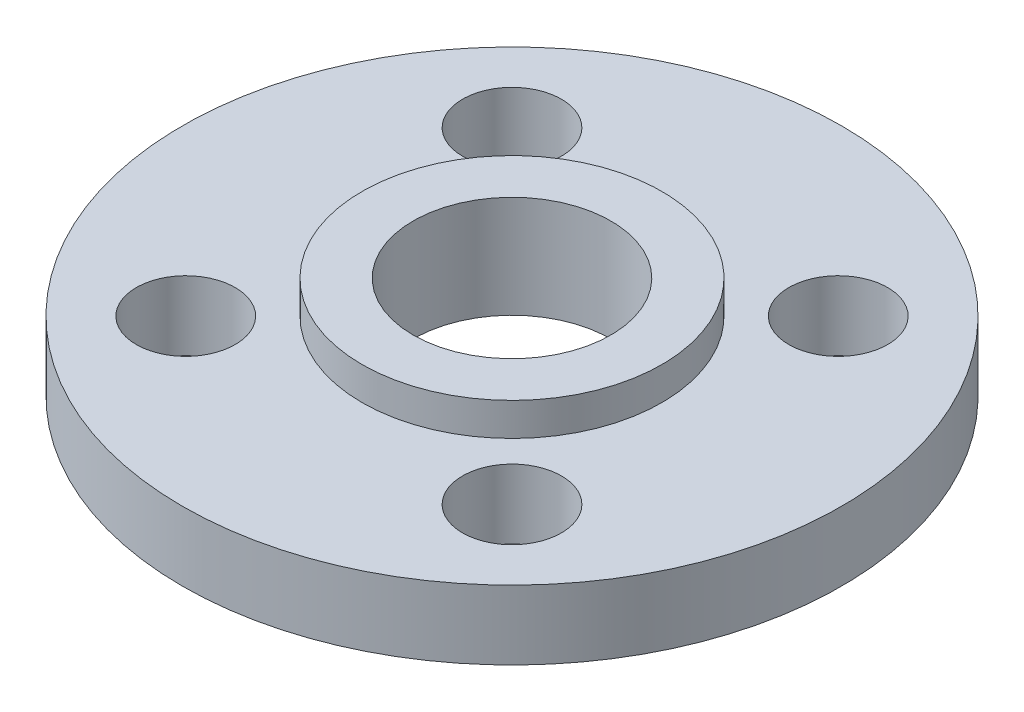
ISO-10303-21;
HEADER;
FILE_DESCRIPTION(('STEP AP214'),'2;1');
FILE_NAME('part.step','',(''),(''),'','','');
FILE_SCHEMA(('AUTOMOTIVE_DESIGN { 1 0 10303 214 1 1 1 1 }'));
ENDSEC;
DATA;
#1=APPLICATION_CONTEXT('core data for automotive mechanical design processes');
#2=APPLICATION_PROTOCOL_DEFINITION('international standard','automotive_design',2000,#1);
#3=PRODUCT_CONTEXT('',#1,'mechanical');
#4=PRODUCT('Part','Part','',(#3));
#5=PRODUCT_RELATED_PRODUCT_CATEGORY('part','',(#4));
#6=PRODUCT_DEFINITION_FORMATION('','',#4);
#7=PRODUCT_DEFINITION_CONTEXT('part definition',#1,'design');
#8=PRODUCT_DEFINITION('design','',#6,#7);
#9=PRODUCT_DEFINITION_SHAPE('','',#8);
#10=(LENGTH_UNIT() NAMED_UNIT(*) SI_UNIT(.MILLI.,.METRE.));
#11=(NAMED_UNIT(*) PLANE_ANGLE_UNIT() SI_UNIT($,.RADIAN.));
#12=(NAMED_UNIT(*) SI_UNIT($,.STERADIAN.) SOLID_ANGLE_UNIT());
#13=UNCERTAINTY_MEASURE_WITH_UNIT(LENGTH_MEASURE(1.E-05),#10,'distance_accuracy_value','');
#14=(GEOMETRIC_REPRESENTATION_CONTEXT(3) GLOBAL_UNCERTAINTY_ASSIGNED_CONTEXT((#13)) GLOBAL_UNIT_ASSIGNED_CONTEXT((#10,
#11,#12)) REPRESENTATION_CONTEXT('',''));
#15=CARTESIAN_POINT('',(0.,0.,0.));
#16=DIRECTION('',(0.,0.,1.));
#17=DIRECTION('',(1.,0.,0.));
#18=AXIS2_PLACEMENT_3D('',#15,#16,#17);
#19=CARTESIAN_POINT('',(0.,2.1,0.));
#20=DIRECTION('',(0.,1.,0.));
#21=DIRECTION('',(0.,0.,1.));
#22=AXIS2_PLACEMENT_3D('',#19,#20,#21);
#23=PLANE('',#22);
#24=CARTESIAN_POINT('',(4.94974746830583,2.1,4.94974746830583));
#25=DIRECTION('',(0.,1.,0.));
#26=DIRECTION('',(0.,0.,1.));
#27=AXIS2_PLACEMENT_3D('',#24,#25,#26);
#28=CIRCLE('',#27,1.5);
#29=CARTESIAN_POINT('',(4.94974746830583,2.1,6.44974746830583));
#30=VERTEX_POINT('',#29);
#31=EDGE_CURVE('E61',#30,#30,#28,.T.);
#32=ORIENTED_EDGE('',*,*,#31,.F.);
#33=EDGE_LOOP('',(#32));
#34=FACE_BOUND('',#33,.T.);
#35=CARTESIAN_POINT('',(-4.94974746830583,2.1,-4.94974746830583));
#36=DIRECTION('',(0.,1.,0.));
#37=DIRECTION('',(0.,0.,1.));
#38=AXIS2_PLACEMENT_3D('',#35,#36,#37);
#39=CIRCLE('',#38,1.5);
#40=CARTESIAN_POINT('',(-4.94974746830583,2.1,-3.44974746830583));
#41=VERTEX_POINT('',#40);
#42=EDGE_CURVE('E49',#41,#41,#39,.T.);
#43=ORIENTED_EDGE('',*,*,#42,.F.);
#44=EDGE_LOOP('',(#43));
#45=FACE_BOUND('',#44,.T.);
#46=CARTESIAN_POINT('',(0.,2.1,0.));
#47=DIRECTION('',(0.,1.,0.));
#48=DIRECTION('',(0.,0.,1.));
#49=AXIS2_PLACEMENT_3D('',#46,#47,#48);
#50=CIRCLE('',#49,10.);
#51=CARTESIAN_POINT('',(0.,2.1,10.));
#52=VERTEX_POINT('',#51);
#53=EDGE_CURVE('E10',#52,#52,#50,.T.);
#54=ORIENTED_EDGE('',*,*,#53,.T.);
#55=EDGE_LOOP('',(#54));
#56=FACE_BOUND('',#55,.T.);
#57=CARTESIAN_POINT('',(-4.94974746830583,2.1,4.94974746830583));
#58=DIRECTION('',(0.,1.,0.));
#59=DIRECTION('',(0.,0.,1.));
#60=AXIS2_PLACEMENT_3D('',#57,#58,#59);
#61=CIRCLE('',#60,1.5);
#62=CARTESIAN_POINT('',(-4.94974746830583,2.1,6.44974746830583));
#63=VERTEX_POINT('',#62);
#64=EDGE_CURVE('E45',#63,#63,#61,.T.);
#65=ORIENTED_EDGE('',*,*,#64,.F.);
#66=EDGE_LOOP('',(#65));
#67=FACE_BOUND('',#66,.T.);
#68=CARTESIAN_POINT('',(4.94974746830583,2.1,-4.94974746830583));
#69=DIRECTION('',(0.,1.,0.));
#70=DIRECTION('',(0.,0.,1.));
#71=AXIS2_PLACEMENT_3D('',#68,#69,#70);
#72=CIRCLE('',#71,1.5);
#73=CARTESIAN_POINT('',(4.94974746830583,2.1,-3.44974746830583));
#74=VERTEX_POINT('',#73);
#75=EDGE_CURVE('E55',#74,#74,#72,.T.);
#76=ORIENTED_EDGE('',*,*,#75,.F.);
#77=EDGE_LOOP('',(#76));
#78=FACE_BOUND('',#77,.T.);
#79=CARTESIAN_POINT('',(0.,2.1,0.));
#80=DIRECTION('',(0.,1.,0.));
#81=DIRECTION('',(0.,0.,1.));
#82=AXIS2_PLACEMENT_3D('',#79,#80,#81);
#83=CIRCLE('',#82,4.55);
#84=CARTESIAN_POINT('',(0.,2.1,4.55));
#85=VERTEX_POINT('',#84);
#86=EDGE_CURVE('E70',#85,#85,#83,.T.);
#87=ORIENTED_EDGE('',*,*,#86,.F.);
#88=EDGE_LOOP('',(#87));
#89=FACE_BOUND('',#88,.T.);
#90=ADVANCED_FACE('F30',(#34,#45,#56,#67,#78,#89),#23,.T.);
#91=CARTESIAN_POINT('',(0.,0.,0.));
#92=DIRECTION('',(0.,1.,0.));
#93=DIRECTION('',(0.,0.,1.));
#94=AXIS2_PLACEMENT_3D('',#91,#92,#93);
#95=PLANE('',#94);
#96=CARTESIAN_POINT('',(0.,0.,0.));
#97=DIRECTION('',(0.,1.,0.));
#98=DIRECTION('',(0.,0.,1.));
#99=AXIS2_PLACEMENT_3D('',#96,#97,#98);
#100=CIRCLE('',#99,10.);
#101=CARTESIAN_POINT('',(0.,0.,10.));
#102=VERTEX_POINT('',#101);
#103=EDGE_CURVE('E34',#102,#102,#100,.T.);
#104=ORIENTED_EDGE('',*,*,#103,.F.);
#105=EDGE_LOOP('',(#104));
#106=FACE_BOUND('',#105,.T.);
#107=CARTESIAN_POINT('',(0.,0.,0.));
#108=DIRECTION('',(0.,1.,0.));
#109=DIRECTION('',(0.,0.,1.));
#110=AXIS2_PLACEMENT_3D('',#107,#108,#109);
#111=CIRCLE('',#110,3.);
#112=CARTESIAN_POINT('',(0.,0.,3.));
#113=VERTEX_POINT('',#112);
#114=EDGE_CURVE('E41',#113,#113,#111,.T.);
#115=ORIENTED_EDGE('',*,*,#114,.T.);
#116=EDGE_LOOP('',(#115));
#117=FACE_BOUND('',#116,.T.);
#118=CARTESIAN_POINT('',(-4.94974746830583,0.,4.94974746830583));
#119=DIRECTION('',(0.,1.,0.));
#120=DIRECTION('',(0.,0.,1.));
#121=AXIS2_PLACEMENT_3D('',#118,#119,#120);
#122=CIRCLE('',#121,1.5);
#123=CARTESIAN_POINT('',(-4.94974746830583,0.,6.44974746830583));
#124=VERTEX_POINT('',#123);
#125=EDGE_CURVE('E46',#124,#124,#122,.T.);
#126=ORIENTED_EDGE('',*,*,#125,.T.);
#127=EDGE_LOOP('',(#126));
#128=FACE_BOUND('',#127,.T.);
#129=CARTESIAN_POINT('',(-4.94974746830583,0.,-4.94974746830583));
#130=DIRECTION('',(0.,1.,0.));
#131=DIRECTION('',(0.,0.,1.));
#132=AXIS2_PLACEMENT_3D('',#129,#130,#131);
#133=CIRCLE('',#132,1.5);
#134=CARTESIAN_POINT('',(-4.94974746830583,0.,-3.44974746830583));
#135=VERTEX_POINT('',#134);
#136=EDGE_CURVE('E52',#135,#135,#133,.T.);
#137=ORIENTED_EDGE('',*,*,#136,.T.);
#138=EDGE_LOOP('',(#137));
#139=FACE_BOUND('',#138,.T.);
#140=CARTESIAN_POINT('',(4.94974746830583,0.,-4.94974746830583));
#141=DIRECTION('',(0.,1.,0.));
#142=DIRECTION('',(0.,0.,1.));
#143=AXIS2_PLACEMENT_3D('',#140,#141,#142);
#144=CIRCLE('',#143,1.5);
#145=CARTESIAN_POINT('',(4.94974746830583,0.,-3.44974746830583));
#146=VERTEX_POINT('',#145);
#147=EDGE_CURVE('E58',#146,#146,#144,.T.);
#148=ORIENTED_EDGE('',*,*,#147,.T.);
#149=EDGE_LOOP('',(#148));
#150=FACE_BOUND('',#149,.T.);
#151=CARTESIAN_POINT('',(4.94974746830583,0.,4.94974746830583));
#152=DIRECTION('',(0.,1.,0.));
#153=DIRECTION('',(0.,0.,1.));
#154=AXIS2_PLACEMENT_3D('',#151,#152,#153);
#155=CIRCLE('',#154,1.5);
#156=CARTESIAN_POINT('',(4.94974746830583,0.,6.44974746830583));
#157=VERTEX_POINT('',#156);
#158=EDGE_CURVE('E64',#157,#157,#155,.T.);
#159=ORIENTED_EDGE('',*,*,#158,.T.);
#160=EDGE_LOOP('',(#159));
#161=FACE_BOUND('',#160,.T.);
#162=ADVANCED_FACE('F97',(#106,#117,#128,#139,#150,#161),#95,.F.);
#163=CARTESIAN_POINT('',(0.,2.1,0.));
#164=DIRECTION('',(0.,-1.,0.));
#165=DIRECTION('',(0.,0.,-1.));
#166=AXIS2_PLACEMENT_3D('',#163,#164,#165);
#167=CYLINDRICAL_SURFACE('',#166,10.);
#168=ORIENTED_EDGE('',*,*,#53,.F.);
#169=EDGE_LOOP('',(#168));
#170=FACE_BOUND('',#169,.T.);
#171=ORIENTED_EDGE('',*,*,#103,.T.);
#172=EDGE_LOOP('',(#171));
#173=FACE_BOUND('',#172,.T.);
#174=ADVANCED_FACE('F32',(#170,#173),#167,.T.);
#175=CARTESIAN_POINT('',(0.,2.1,0.));
#176=DIRECTION('',(0.,-1.,0.));
#177=DIRECTION('',(0.,0.,-1.));
#178=AXIS2_PLACEMENT_3D('',#175,#176,#177);
#179=CYLINDRICAL_SURFACE('',#178,3.);
#180=ORIENTED_EDGE('',*,*,#114,.F.);
#181=EDGE_LOOP('',(#180));
#182=FACE_BOUND('',#181,.T.);
#183=CARTESIAN_POINT('',(0.,3.1,0.));
#184=DIRECTION('',(0.,1.,0.));
#185=DIRECTION('',(0.,0.,1.));
#186=AXIS2_PLACEMENT_3D('',#183,#184,#185);
#187=CIRCLE('',#186,3.);
#188=CARTESIAN_POINT('',(0.,3.1,3.));
#189=VERTEX_POINT('',#188);
#190=EDGE_CURVE('E73',#189,#189,#187,.T.);
#191=ORIENTED_EDGE('',*,*,#190,.T.);
#192=EDGE_LOOP('',(#191));
#193=FACE_BOUND('',#192,.T.);
#194=ADVANCED_FACE('F79',(#182,#193),#179,.F.);
#195=CARTESIAN_POINT('',(-4.94974746830583,2.1,4.94974746830583));
#196=DIRECTION('',(0.,-1.,0.));
#197=DIRECTION('',(0.,0.,-1.));
#198=AXIS2_PLACEMENT_3D('',#195,#196,#197);
#199=CYLINDRICAL_SURFACE('',#198,1.5);
#200=ORIENTED_EDGE('',*,*,#64,.T.);
#201=EDGE_LOOP('',(#200));
#202=FACE_BOUND('',#201,.T.);
#203=ORIENTED_EDGE('',*,*,#125,.F.);
#204=EDGE_LOOP('',(#203));
#205=FACE_BOUND('',#204,.T.);
#206=ADVANCED_FACE('F109',(#202,#205),#199,.F.);
#207=CARTESIAN_POINT('',(-4.94974746830583,2.1,-4.94974746830583));
#208=DIRECTION('',(0.,-1.,0.));
#209=DIRECTION('',(0.,0.,-1.));
#210=AXIS2_PLACEMENT_3D('',#207,#208,#209);
#211=CYLINDRICAL_SURFACE('',#210,1.5);
#212=ORIENTED_EDGE('',*,*,#42,.T.);
#213=EDGE_LOOP('',(#212));
#214=FACE_BOUND('',#213,.T.);
#215=ORIENTED_EDGE('',*,*,#136,.F.);
#216=EDGE_LOOP('',(#215));
#217=FACE_BOUND('',#216,.T.);
#218=ADVANCED_FACE('F113',(#214,#217),#211,.F.);
#219=CARTESIAN_POINT('',(4.94974746830583,2.1,-4.94974746830583));
#220=DIRECTION('',(0.,-1.,0.));
#221=DIRECTION('',(0.,0.,-1.));
#222=AXIS2_PLACEMENT_3D('',#219,#220,#221);
#223=CYLINDRICAL_SURFACE('',#222,1.5);
#224=ORIENTED_EDGE('',*,*,#75,.T.);
#225=EDGE_LOOP('',(#224));
#226=FACE_BOUND('',#225,.T.);
#227=ORIENTED_EDGE('',*,*,#147,.F.);
#228=EDGE_LOOP('',(#227));
#229=FACE_BOUND('',#228,.T.);
#230=ADVANCED_FACE('F93',(#226,#229),#223,.F.);
#231=CARTESIAN_POINT('',(4.94974746830583,2.1,4.94974746830583));
#232=DIRECTION('',(0.,-1.,0.));
#233=DIRECTION('',(0.,0.,-1.));
#234=AXIS2_PLACEMENT_3D('',#231,#232,#233);
#235=CYLINDRICAL_SURFACE('',#234,1.5);
#236=ORIENTED_EDGE('',*,*,#31,.T.);
#237=EDGE_LOOP('',(#236));
#238=FACE_BOUND('',#237,.T.);
#239=ORIENTED_EDGE('',*,*,#158,.F.);
#240=EDGE_LOOP('',(#239));
#241=FACE_BOUND('',#240,.T.);
#242=ADVANCED_FACE('F84',(#238,#241),#235,.F.);
#243=CARTESIAN_POINT('',(0.,3.1,0.));
#244=DIRECTION('',(0.,1.,0.));
#245=DIRECTION('',(0.,0.,1.));
#246=AXIS2_PLACEMENT_3D('',#243,#244,#245);
#247=PLANE('',#246);
#248=CARTESIAN_POINT('',(0.,3.1,0.));
#249=DIRECTION('',(0.,1.,0.));
#250=DIRECTION('',(0.,0.,1.));
#251=AXIS2_PLACEMENT_3D('',#248,#249,#250);
#252=CIRCLE('',#251,4.55);
#253=CARTESIAN_POINT('',(0.,3.1,4.55));
#254=VERTEX_POINT('',#253);
#255=EDGE_CURVE('E67',#254,#254,#252,.T.);
#256=ORIENTED_EDGE('',*,*,#255,.T.);
#257=EDGE_LOOP('',(#256));
#258=FACE_BOUND('',#257,.T.);
#259=ORIENTED_EDGE('',*,*,#190,.F.);
#260=EDGE_LOOP('',(#259));
#261=FACE_BOUND('',#260,.T.);
#262=ADVANCED_FACE('F81',(#258,#261),#247,.T.);
#263=CARTESIAN_POINT('',(0.,3.1,0.));
#264=DIRECTION('',(0.,-1.,0.));
#265=DIRECTION('',(0.,0.,-1.));
#266=AXIS2_PLACEMENT_3D('',#263,#264,#265);
#267=CYLINDRICAL_SURFACE('',#266,4.55);
#268=ORIENTED_EDGE('',*,*,#255,.F.);
#269=EDGE_LOOP('',(#268));
#270=FACE_BOUND('',#269,.T.);
#271=ORIENTED_EDGE('',*,*,#86,.T.);
#272=EDGE_LOOP('',(#271));
#273=FACE_BOUND('',#272,.T.);
#274=ADVANCED_FACE('F83',(#270,#273),#267,.T.);
#275=CLOSED_SHELL('',(#90,#162,#174,#194,#206,#218,#230,#242,#262,#274));
#276=MANIFOLD_SOLID_BREP('B2',#275);
#277=ADVANCED_BREP_SHAPE_REPRESENTATION('',(#18,#276),#14);
#278=SHAPE_DEFINITION_REPRESENTATION(#9,#277);
ENDSEC;
END-ISO-10303-21;
